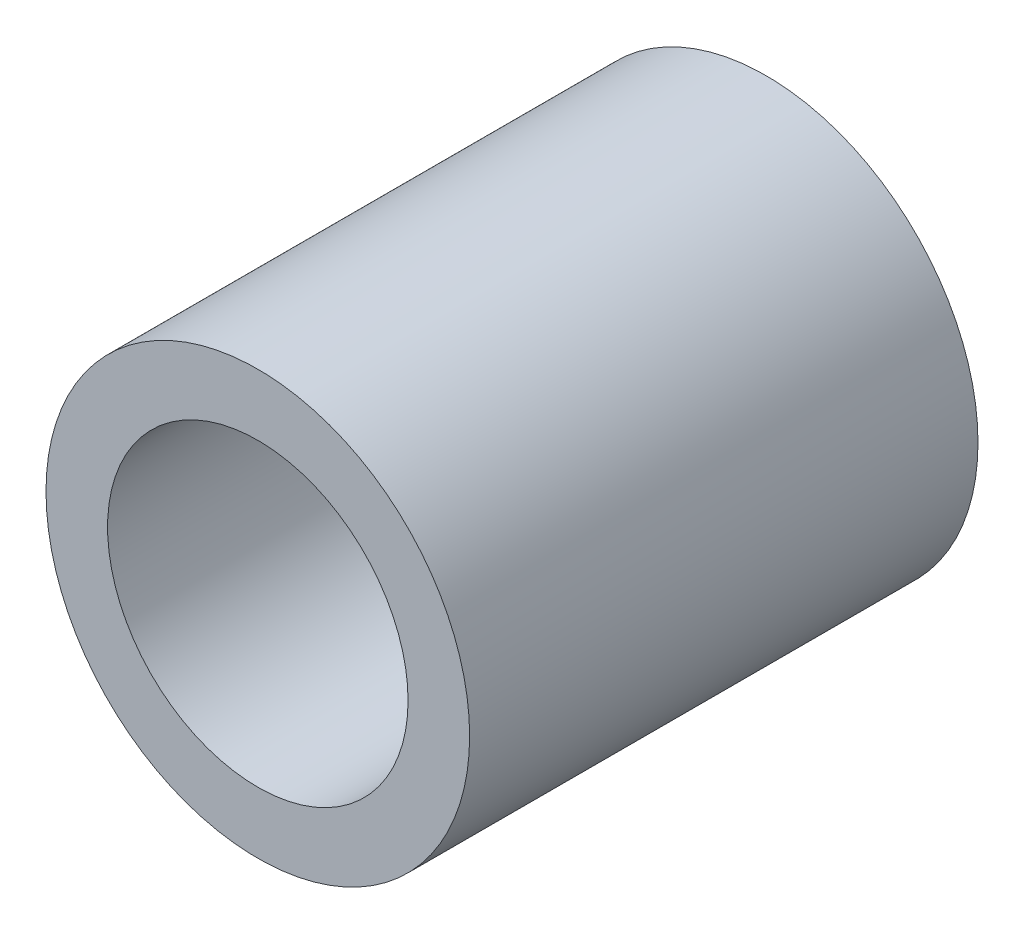
ISO-10303-21;
HEADER;
FILE_DESCRIPTION(('STEP AP214'),'2;1');
FILE_NAME('part.step','',(''),(''),'','','');
FILE_SCHEMA(('AUTOMOTIVE_DESIGN { 1 0 10303 214 1 1 1 1 }'));
ENDSEC;
DATA;
#1=APPLICATION_CONTEXT('core data for automotive mechanical design processes');
#2=APPLICATION_PROTOCOL_DEFINITION('international standard','automotive_design',2000,#1);
#3=PRODUCT_CONTEXT('',#1,'mechanical');
#4=PRODUCT('Part','Part','',(#3));
#5=PRODUCT_RELATED_PRODUCT_CATEGORY('part','',(#4));
#6=PRODUCT_DEFINITION_FORMATION('','',#4);
#7=PRODUCT_DEFINITION_CONTEXT('part definition',#1,'design');
#8=PRODUCT_DEFINITION('design','',#6,#7);
#9=PRODUCT_DEFINITION_SHAPE('','',#8);
#10=(LENGTH_UNIT() NAMED_UNIT(*) SI_UNIT(.MILLI.,.METRE.));
#11=(NAMED_UNIT(*) PLANE_ANGLE_UNIT() SI_UNIT($,.RADIAN.));
#12=(NAMED_UNIT(*) SI_UNIT($,.STERADIAN.) SOLID_ANGLE_UNIT());
#13=UNCERTAINTY_MEASURE_WITH_UNIT(LENGTH_MEASURE(1.E-05),#10,'distance_accuracy_value','');
#14=(GEOMETRIC_REPRESENTATION_CONTEXT(3) GLOBAL_UNCERTAINTY_ASSIGNED_CONTEXT((#13)) GLOBAL_UNIT_ASSIGNED_CONTEXT((#10,
#11,#12)) REPRESENTATION_CONTEXT('',''));
#15=CARTESIAN_POINT('',(0.,0.,0.));
#16=DIRECTION('',(0.,0.,1.));
#17=DIRECTION('',(1.,0.,0.));
#18=AXIS2_PLACEMENT_3D('',#15,#16,#17);
#19=CARTESIAN_POINT('',(0.,0.,11.43));
#20=DIRECTION('',(0.,0.,1.));
#21=DIRECTION('',(1.,0.,0.));
#22=AXIS2_PLACEMENT_3D('',#19,#20,#21);
#23=PLANE('',#22);
#24=CARTESIAN_POINT('',(0.,0.,11.43));
#25=DIRECTION('',(0.,0.,1.));
#26=DIRECTION('',(1.,0.,0.));
#27=AXIS2_PLACEMENT_3D('',#24,#25,#26);
#28=CIRCLE('',#27,4.7625);
#29=CARTESIAN_POINT('',(4.7625,0.,11.43));
#30=VERTEX_POINT('',#29);
#31=EDGE_CURVE('E10',#30,#30,#28,.T.);
#32=ORIENTED_EDGE('',*,*,#31,.T.);
#33=EDGE_LOOP('',(#32));
#34=FACE_BOUND('',#33,.T.);
#35=CARTESIAN_POINT('',(0.,0.,11.43));
#36=DIRECTION('',(0.,0.,1.));
#37=DIRECTION('',(1.,0.,0.));
#38=AXIS2_PLACEMENT_3D('',#35,#36,#37);
#39=CIRCLE('',#38,3.3782);
#40=CARTESIAN_POINT('',(3.3782,0.,11.43));
#41=VERTEX_POINT('',#40);
#42=EDGE_CURVE('E45',#41,#41,#39,.T.);
#43=ORIENTED_EDGE('',*,*,#42,.F.);
#44=EDGE_LOOP('',(#43));
#45=FACE_BOUND('',#44,.T.);
#46=ADVANCED_FACE('F34',(#34,#45),#23,.T.);
#47=CARTESIAN_POINT('',(0.,0.,0.));
#48=DIRECTION('',(0.,0.,1.));
#49=DIRECTION('',(1.,0.,0.));
#50=AXIS2_PLACEMENT_3D('',#47,#48,#49);
#51=PLANE('',#50);
#52=CARTESIAN_POINT('',(0.,0.,0.));
#53=DIRECTION('',(0.,0.,1.));
#54=DIRECTION('',(1.,0.,0.));
#55=AXIS2_PLACEMENT_3D('',#52,#53,#54);
#56=CIRCLE('',#55,4.7625);
#57=CARTESIAN_POINT('',(4.7625,0.,0.));
#58=VERTEX_POINT('',#57);
#59=EDGE_CURVE('E38',#58,#58,#56,.T.);
#60=ORIENTED_EDGE('',*,*,#59,.F.);
#61=EDGE_LOOP('',(#60));
#62=FACE_BOUND('',#61,.T.);
#63=CARTESIAN_POINT('',(0.,0.,0.));
#64=DIRECTION('',(0.,0.,1.));
#65=DIRECTION('',(1.,0.,0.));
#66=AXIS2_PLACEMENT_3D('',#63,#64,#65);
#67=CIRCLE('',#66,3.3782);
#68=CARTESIAN_POINT('',(3.3782,0.,0.));
#69=VERTEX_POINT('',#68);
#70=EDGE_CURVE('E47',#69,#69,#67,.T.);
#71=ORIENTED_EDGE('',*,*,#70,.T.);
#72=EDGE_LOOP('',(#71));
#73=FACE_BOUND('',#72,.T.);
#74=ADVANCED_FACE('F57',(#62,#73),#51,.F.);
#75=CARTESIAN_POINT('',(0.,0.,11.43));
#76=DIRECTION('',(0.,0.,-1.));
#77=DIRECTION('',(-1.,0.,0.));
#78=AXIS2_PLACEMENT_3D('',#75,#76,#77);
#79=CYLINDRICAL_SURFACE('',#78,4.7625);
#80=ORIENTED_EDGE('',*,*,#31,.F.);
#81=EDGE_LOOP('',(#80));
#82=FACE_BOUND('',#81,.T.);
#83=ORIENTED_EDGE('',*,*,#59,.T.);
#84=EDGE_LOOP('',(#83));
#85=FACE_BOUND('',#84,.T.);
#86=ADVANCED_FACE('F36',(#82,#85),#79,.T.);
#87=CARTESIAN_POINT('',(0.,0.,11.43));
#88=DIRECTION('',(0.,0.,-1.));
#89=DIRECTION('',(-1.,0.,0.));
#90=AXIS2_PLACEMENT_3D('',#87,#88,#89);
#91=CYLINDRICAL_SURFACE('',#90,3.3782);
#92=ORIENTED_EDGE('',*,*,#42,.T.);
#93=EDGE_LOOP('',(#92));
#94=FACE_BOUND('',#93,.T.);
#95=ORIENTED_EDGE('',*,*,#70,.F.);
#96=EDGE_LOOP('',(#95));
#97=FACE_BOUND('',#96,.T.);
#98=ADVANCED_FACE('F53',(#94,#97),#91,.F.);
#99=CLOSED_SHELL('',(#46,#74,#86,#98));
#100=MANIFOLD_SOLID_BREP('B2',#99);
#101=ADVANCED_BREP_SHAPE_REPRESENTATION('',(#18,#100),#14);
#102=SHAPE_DEFINITION_REPRESENTATION(#9,#101);
ENDSEC;
END-ISO-10303-21;
